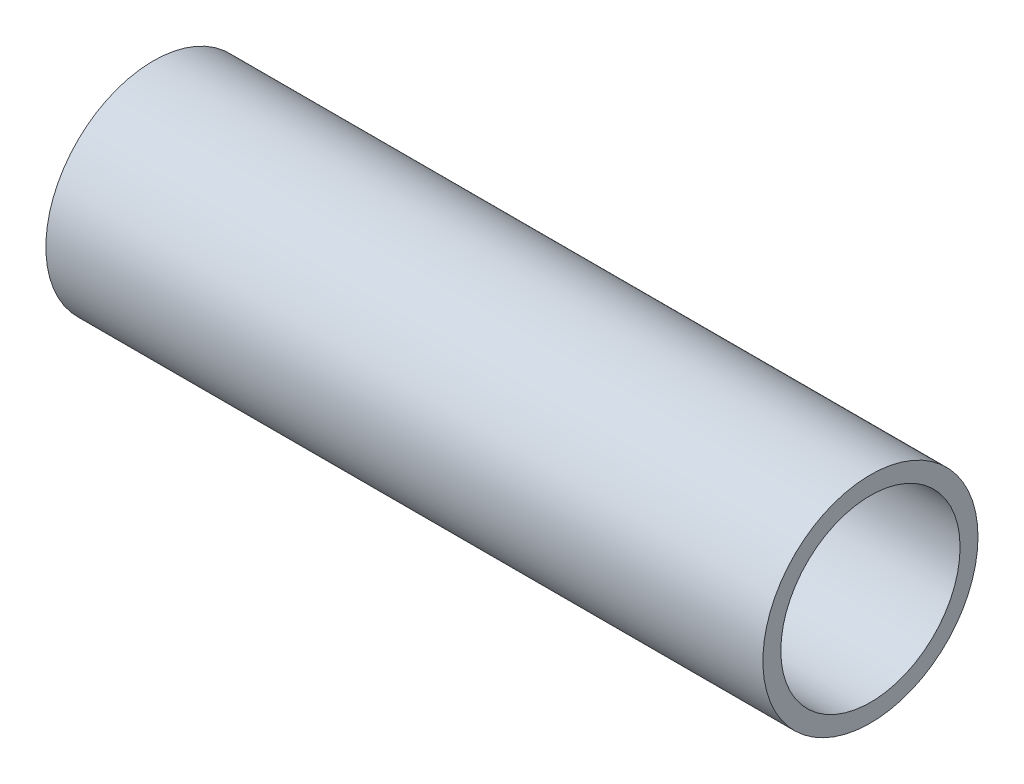
ISO-10303-21;
HEADER;
FILE_DESCRIPTION(('STEP AP214'),'2;1');
FILE_NAME('part.step','',(''),(''),'','','');
FILE_SCHEMA(('AUTOMOTIVE_DESIGN { 1 0 10303 214 1 1 1 1 }'));
ENDSEC;
DATA;
#1=APPLICATION_CONTEXT('core data for automotive mechanical design processes');
#2=APPLICATION_PROTOCOL_DEFINITION('international standard','automotive_design',2000,#1);
#3=PRODUCT_CONTEXT('',#1,'mechanical');
#4=PRODUCT('Part','Part','',(#3));
#5=PRODUCT_RELATED_PRODUCT_CATEGORY('part','',(#4));
#6=PRODUCT_DEFINITION_FORMATION('','',#4);
#7=PRODUCT_DEFINITION_CONTEXT('part definition',#1,'design');
#8=PRODUCT_DEFINITION('design','',#6,#7);
#9=PRODUCT_DEFINITION_SHAPE('','',#8);
#10=(LENGTH_UNIT() NAMED_UNIT(*) SI_UNIT(.MILLI.,.METRE.));
#11=(NAMED_UNIT(*) PLANE_ANGLE_UNIT() SI_UNIT($,.RADIAN.));
#12=(NAMED_UNIT(*) SI_UNIT($,.STERADIAN.) SOLID_ANGLE_UNIT());
#13=UNCERTAINTY_MEASURE_WITH_UNIT(LENGTH_MEASURE(1.E-05),#10,'distance_accuracy_value','');
#14=(GEOMETRIC_REPRESENTATION_CONTEXT(3) GLOBAL_UNCERTAINTY_ASSIGNED_CONTEXT((#13)) GLOBAL_UNIT_ASSIGNED_CONTEXT((#10,
#11,#12)) REPRESENTATION_CONTEXT('',''));
#15=CARTESIAN_POINT('',(0.,0.,0.));
#16=DIRECTION('',(0.,0.,1.));
#17=DIRECTION('',(1.,0.,0.));
#18=AXIS2_PLACEMENT_3D('',#15,#16,#17);
#19=CARTESIAN_POINT('',(12.7,0.,0.));
#20=DIRECTION('',(1.,0.,0.));
#21=DIRECTION('',(0.,0.,-1.));
#22=AXIS2_PLACEMENT_3D('',#19,#20,#21);
#23=PLANE('',#22);
#24=CARTESIAN_POINT('',(12.7,0.,0.));
#25=DIRECTION('',(1.,0.,0.));
#26=DIRECTION('',(0.,0.,-1.));
#27=AXIS2_PLACEMENT_3D('',#24,#25,#26);
#28=CIRCLE('',#27,1.905);
#29=CARTESIAN_POINT('',(12.7,0.,-1.905));
#30=VERTEX_POINT('',#29);
#31=EDGE_CURVE('E10',#30,#30,#28,.T.);
#32=ORIENTED_EDGE('',*,*,#31,.T.);
#33=EDGE_LOOP('',(#32));
#34=FACE_BOUND('',#33,.T.);
#35=CARTESIAN_POINT('',(12.7,0.,0.));
#36=DIRECTION('',(1.,0.,0.));
#37=DIRECTION('',(0.,0.,-1.));
#38=AXIS2_PLACEMENT_3D('',#35,#36,#37);
#39=CIRCLE('',#38,1.5875);
#40=CARTESIAN_POINT('',(12.7,0.,-1.5875));
#41=VERTEX_POINT('',#40);
#42=EDGE_CURVE('E41',#41,#41,#39,.T.);
#43=ORIENTED_EDGE('',*,*,#42,.F.);
#44=EDGE_LOOP('',(#43));
#45=FACE_BOUND('',#44,.T.);
#46=ADVANCED_FACE('F30',(#34,#45),#23,.T.);
#47=CARTESIAN_POINT('',(0.,0.,0.));
#48=DIRECTION('',(1.,0.,0.));
#49=DIRECTION('',(0.,0.,-1.));
#50=AXIS2_PLACEMENT_3D('',#47,#48,#49);
#51=PLANE('',#50);
#52=CARTESIAN_POINT('',(0.,0.,0.));
#53=DIRECTION('',(1.,0.,0.));
#54=DIRECTION('',(0.,0.,-1.));
#55=AXIS2_PLACEMENT_3D('',#52,#53,#54);
#56=CIRCLE('',#55,1.905);
#57=CARTESIAN_POINT('',(0.,0.,-1.905));
#58=VERTEX_POINT('',#57);
#59=EDGE_CURVE('E34',#58,#58,#56,.T.);
#60=ORIENTED_EDGE('',*,*,#59,.F.);
#61=EDGE_LOOP('',(#60));
#62=FACE_BOUND('',#61,.T.);
#63=CARTESIAN_POINT('',(0.,0.,0.));
#64=DIRECTION('',(1.,0.,0.));
#65=DIRECTION('',(0.,0.,-1.));
#66=AXIS2_PLACEMENT_3D('',#63,#64,#65);
#67=CIRCLE('',#66,1.5875);
#68=CARTESIAN_POINT('',(0.,0.,-1.5875));
#69=VERTEX_POINT('',#68);
#70=EDGE_CURVE('E43',#69,#69,#67,.T.);
#71=ORIENTED_EDGE('',*,*,#70,.T.);
#72=EDGE_LOOP('',(#71));
#73=FACE_BOUND('',#72,.T.);
#74=ADVANCED_FACE('F53',(#62,#73),#51,.F.);
#75=CARTESIAN_POINT('',(12.7,0.,0.));
#76=DIRECTION('',(-1.,0.,0.));
#77=DIRECTION('',(0.,0.,1.));
#78=AXIS2_PLACEMENT_3D('',#75,#76,#77);
#79=CYLINDRICAL_SURFACE('',#78,1.905);
#80=ORIENTED_EDGE('',*,*,#31,.F.);
#81=EDGE_LOOP('',(#80));
#82=FACE_BOUND('',#81,.T.);
#83=ORIENTED_EDGE('',*,*,#59,.T.);
#84=EDGE_LOOP('',(#83));
#85=FACE_BOUND('',#84,.T.);
#86=ADVANCED_FACE('F32',(#82,#85),#79,.T.);
#87=CARTESIAN_POINT('',(12.7,0.,0.));
#88=DIRECTION('',(-1.,0.,0.));
#89=DIRECTION('',(0.,0.,1.));
#90=AXIS2_PLACEMENT_3D('',#87,#88,#89);
#91=CYLINDRICAL_SURFACE('',#90,1.5875);
#92=ORIENTED_EDGE('',*,*,#42,.T.);
#93=EDGE_LOOP('',(#92));
#94=FACE_BOUND('',#93,.T.);
#95=ORIENTED_EDGE('',*,*,#70,.F.);
#96=EDGE_LOOP('',(#95));
#97=FACE_BOUND('',#96,.T.);
#98=ADVANCED_FACE('F49',(#94,#97),#91,.F.);
#99=CLOSED_SHELL('',(#46,#74,#86,#98));
#100=MANIFOLD_SOLID_BREP('B2',#99);
#101=ADVANCED_BREP_SHAPE_REPRESENTATION('',(#18,#100),#14);
#102=SHAPE_DEFINITION_REPRESENTATION(#9,#101);
ENDSEC;
END-ISO-10303-21;
